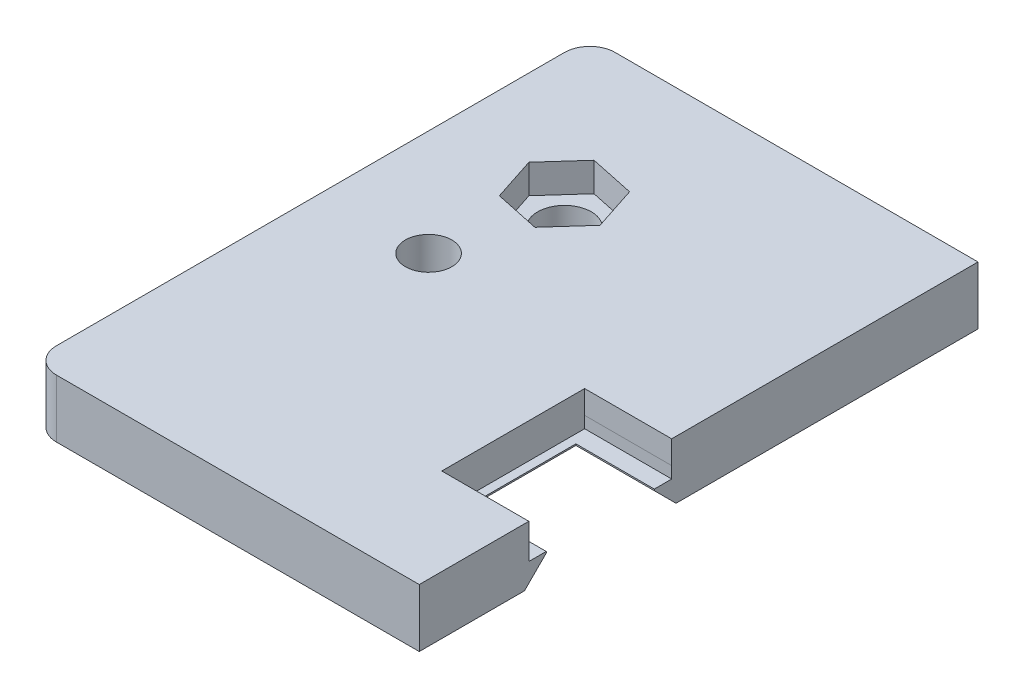
ISO-10303-21;
HEADER;
FILE_DESCRIPTION(('STEP AP214'),'2;1');
FILE_NAME('part.step','',(''),(''),'','','');
FILE_SCHEMA(('AUTOMOTIVE_DESIGN { 1 0 10303 214 1 1 1 1 }'));
ENDSEC;
DATA;
#1=APPLICATION_CONTEXT('core data for automotive mechanical design processes');
#2=APPLICATION_PROTOCOL_DEFINITION('international standard','automotive_design',2000,#1);
#3=PRODUCT_CONTEXT('',#1,'mechanical');
#4=PRODUCT('Part','Part','',(#3));
#5=PRODUCT_RELATED_PRODUCT_CATEGORY('part','',(#4));
#6=PRODUCT_DEFINITION_FORMATION('','',#4);
#7=PRODUCT_DEFINITION_CONTEXT('part definition',#1,'design');
#8=PRODUCT_DEFINITION('design','',#6,#7);
#9=PRODUCT_DEFINITION_SHAPE('','',#8);
#10=(LENGTH_UNIT() NAMED_UNIT(*) SI_UNIT(.MILLI.,.METRE.));
#11=(NAMED_UNIT(*) PLANE_ANGLE_UNIT() SI_UNIT($,.RADIAN.));
#12=(NAMED_UNIT(*) SI_UNIT($,.STERADIAN.) SOLID_ANGLE_UNIT());
#13=UNCERTAINTY_MEASURE_WITH_UNIT(LENGTH_MEASURE(1.E-05),#10,'distance_accuracy_value','');
#14=(GEOMETRIC_REPRESENTATION_CONTEXT(3) GLOBAL_UNCERTAINTY_ASSIGNED_CONTEXT((#13)) GLOBAL_UNIT_ASSIGNED_CONTEXT((#10,
#11,#12)) REPRESENTATION_CONTEXT('',''));
#15=CARTESIAN_POINT('',(0.,0.,0.));
#16=DIRECTION('',(0.,0.,1.));
#17=DIRECTION('',(1.,0.,0.));
#18=AXIS2_PLACEMENT_3D('',#15,#16,#17);
#19=CARTESIAN_POINT('',(0.,4.,0.));
#20=DIRECTION('',(0.,-1.,0.));
#21=DIRECTION('',(0.,0.,-1.));
#22=AXIS2_PLACEMENT_3D('',#19,#20,#21);
#23=PLANE('',#22);
#24=DIRECTION('',(0.,0.,1.));
#25=VECTOR('',#24,1.);
#26=CARTESIAN_POINT('',(0.,4.,0.));
#27=LINE('',#26,#25);
#28=CARTESIAN_POINT('',(0.,4.,-36.75));
#29=VERTEX_POINT('',#28);
#30=CARTESIAN_POINT('',(0.,4.,-1.75));
#31=VERTEX_POINT('',#30);
#32=EDGE_CURVE('E329',#29,#31,#27,.T.);
#33=ORIENTED_EDGE('',*,*,#32,.T.);
#34=CARTESIAN_POINT('',(1.75,4.,-1.75));
#35=DIRECTION('',(0.,-1.,0.));
#36=DIRECTION('',(0.,0.,-1.));
#37=AXIS2_PLACEMENT_3D('',#34,#35,#36);
#38=CIRCLE('',#37,1.75);
#39=CARTESIAN_POINT('',(1.75,4.,0.));
#40=VERTEX_POINT('',#39);
#41=EDGE_CURVE('E56',#31,#40,#38,.F.);
#42=ORIENTED_EDGE('',*,*,#41,.T.);
#43=DIRECTION('',(1.,0.,0.));
#44=VECTOR('',#43,1.);
#45=CARTESIAN_POINT('',(0.,4.,0.));
#46=LINE('',#45,#44);
#47=CARTESIAN_POINT('',(26.75,4.,0.));
#48=VERTEX_POINT('',#47);
#49=EDGE_CURVE('E332',#40,#48,#46,.T.);
#50=ORIENTED_EDGE('',*,*,#49,.T.);
#51=DIRECTION('',(0.,0.,-1.));
#52=VECTOR('',#51,1.);
#53=CARTESIAN_POINT('',(26.75,4.,0.));
#54=LINE('',#53,#52);
#55=CARTESIAN_POINT('',(26.75,4.,-7.55));
#56=VERTEX_POINT('',#55);
#57=EDGE_CURVE('E335',#48,#56,#54,.T.);
#58=ORIENTED_EDGE('',*,*,#57,.T.);
#59=DIRECTION('',(1.,0.,0.));
#60=VECTOR('',#59,1.);
#61=CARTESIAN_POINT('',(10.777724288724,4.,-7.55));
#62=LINE('',#61,#60);
#63=CARTESIAN_POINT('',(20.75,4.,-7.55));
#64=VERTEX_POINT('',#63);
#65=EDGE_CURVE('E278',#64,#56,#62,.T.);
#66=ORIENTED_EDGE('',*,*,#65,.F.);
#67=DIRECTION('',(0.,0.,-1.));
#68=VECTOR('',#67,1.);
#69=CARTESIAN_POINT('',(20.75,4.,-7.55));
#70=LINE('',#69,#68);
#71=CARTESIAN_POINT('',(20.75,4.,-17.3930829957745));
#72=VERTEX_POINT('',#71);
#73=EDGE_CURVE('E277',#64,#72,#70,.T.);
#74=ORIENTED_EDGE('',*,*,#73,.T.);
#75=DIRECTION('',(1.,0.,0.));
#76=VECTOR('',#75,1.);
#77=CARTESIAN_POINT('',(10.777724288724,4.,-17.3930829957745));
#78=LINE('',#77,#76);
#79=CARTESIAN_POINT('',(26.75,4.,-17.3930829957745));
#80=VERTEX_POINT('',#79);
#81=EDGE_CURVE('E286',#72,#80,#78,.T.);
#82=ORIENTED_EDGE('',*,*,#81,.T.);
#83=DIRECTION('',(0.,0.,-1.));
#84=VECTOR('',#83,1.);
#85=CARTESIAN_POINT('',(26.75,4.,-16.1946218655453));
#86=LINE('',#85,#84);
#87=CARTESIAN_POINT('',(26.75,4.,-38.5));
#88=VERTEX_POINT('',#87);
#89=EDGE_CURVE('E338',#80,#88,#86,.T.);
#90=ORIENTED_EDGE('',*,*,#89,.T.);
#91=DIRECTION('',(-1.,0.,0.));
#92=VECTOR('',#91,1.);
#93=CARTESIAN_POINT('',(0.,4.,-38.5));
#94=LINE('',#93,#92);
#95=CARTESIAN_POINT('',(1.75,4.,-38.5));
#96=VERTEX_POINT('',#95);
#97=EDGE_CURVE('E340',#88,#96,#94,.T.);
#98=ORIENTED_EDGE('',*,*,#97,.T.);
#99=CARTESIAN_POINT('',(1.75,4.,-36.75));
#100=DIRECTION('',(0.,-1.,0.));
#101=DIRECTION('',(0.,0.,-1.));
#102=AXIS2_PLACEMENT_3D('',#99,#100,#101);
#103=CIRCLE('',#102,1.75);
#104=EDGE_CURVE('E411',#96,#29,#103,.F.);
#105=ORIENTED_EDGE('',*,*,#104,.T.);
#106=EDGE_LOOP('',(#33,#42,#50,#58,#66,#74,#82,#90,#98,#105));
#107=FACE_BOUND('',#106,.T.);
#108=CARTESIAN_POINT('',(7.30700000000005,4.,-20.0850000000001));
#109=DIRECTION('',(0.,1.,0.));
#110=DIRECTION('',(0.,0.,1.));
#111=AXIS2_PLACEMENT_3D('',#108,#109,#110);
#112=CIRCLE('',#111,1.59999999999998);
#113=CARTESIAN_POINT('',(7.30700000000005,4.,-18.4850000000001));
#114=VERTEX_POINT('',#113);
#115=EDGE_CURVE('E268',#114,#114,#112,.T.);
#116=ORIENTED_EDGE('',*,*,#115,.F.);
#117=EDGE_LOOP('',(#116));
#118=FACE_BOUND('',#117,.T.);
#119=DIRECTION('',(-0.309846757313897,0.,-0.950786509676101));
#120=VECTOR('',#119,1.);
#121=CARTESIAN_POINT('',(11.5412550495234,4.,-27.6638868283969));
#122=LINE('',#121,#120);
#123=CARTESIAN_POINT('',(11.5412550495234,4.,-27.6638868283969));
#124=VERTEX_POINT('',#123);
#125=CARTESIAN_POINT('',(10.5573594514385,4.,-30.6830394885654));
#126=VERTEX_POINT('',#125);
#127=EDGE_CURVE('E211',#124,#126,#122,.T.);
#128=ORIENTED_EDGE('',*,*,#127,.F.);
#129=DIRECTION('',(0.668481892298094,0.,-0.743728417952117));
#130=VECTOR('',#129,1.);
#131=CARTESIAN_POINT('',(9.41853994695661,4.,-25.3022319156994));
#132=LINE('',#131,#130);
#133=CARTESIAN_POINT('',(9.41853994695661,4.,-25.3022319156994));
#134=VERTEX_POINT('',#133);
#135=EDGE_CURVE('E244',#134,#124,#132,.T.);
#136=ORIENTED_EDGE('',*,*,#135,.F.);
#137=DIRECTION('',(0.978328649611991,0.,0.207058091723984));
#138=VECTOR('',#137,1.);
#139=CARTESIAN_POINT('',(6.31192924630488,4.,-25.9597296631704));
#140=LINE('',#139,#138);
#141=CARTESIAN_POINT('',(6.31192924630488,4.,-25.9597296631704));
#142=VERTEX_POINT('',#141);
#143=EDGE_CURVE('E242',#142,#134,#140,.T.);
#144=ORIENTED_EDGE('',*,*,#143,.F.);
#145=DIRECTION('',(0.309846757313897,0.,0.950786509676101));
#146=VECTOR('',#145,1.);
#147=CARTESIAN_POINT('',(5.32803364821996,4.,-28.9788823233389));
#148=LINE('',#147,#146);
#149=CARTESIAN_POINT('',(5.32803364821996,4.,-28.9788823233389));
#150=VERTEX_POINT('',#149);
#151=EDGE_CURVE('E237',#150,#142,#148,.T.);
#152=ORIENTED_EDGE('',*,*,#151,.F.);
#153=DIRECTION('',(-0.668481892298094,0.,0.743728417952117));
#154=VECTOR('',#153,1.);
#155=CARTESIAN_POINT('',(7.45074875078679,4.,-31.3405372360364));
#156=LINE('',#155,#154);
#157=CARTESIAN_POINT('',(7.45074875078679,4.,-31.3405372360364));
#158=VERTEX_POINT('',#157);
#159=EDGE_CURVE('E235',#158,#150,#156,.T.);
#160=ORIENTED_EDGE('',*,*,#159,.F.);
#161=DIRECTION('',(-0.978328649611991,0.,-0.207058091723984));
#162=VECTOR('',#161,1.);
#163=CARTESIAN_POINT('',(10.5573594514385,4.,-30.6830394885654));
#164=LINE('',#163,#162);
#165=EDGE_CURVE('E222',#126,#158,#164,.T.);
#166=ORIENTED_EDGE('',*,*,#165,.F.);
#167=EDGE_LOOP('',(#128,#136,#144,#152,#160,#166));
#168=FACE_BOUND('',#167,.T.);
#169=ADVANCED_FACE('F48',(#107,#118,#168),#23,.F.);
#170=CARTESIAN_POINT('',(8.43464434887167,9.23259018078046,-28.3213845758679));
#171=DIRECTION('',(0.,-1.,0.));
#172=DIRECTION('',(0.,0.,-1.));
#173=AXIS2_PLACEMENT_3D('',#170,#171,#172);
#174=CYLINDRICAL_SURFACE('',#173,1.85);
#175=CARTESIAN_POINT('',(8.43464434887167,0.,-28.3213845758679));
#176=DIRECTION('',(0.,-1.,0.));
#177=DIRECTION('',(0.,0.,-1.));
#178=AXIS2_PLACEMENT_3D('',#175,#176,#177);
#179=CIRCLE('',#178,1.85);
#180=CARTESIAN_POINT('',(8.43464434887167,0.,-30.1713845758679));
#181=VERTEX_POINT('',#180);
#182=EDGE_CURVE('E230',#181,#181,#179,.T.);
#183=ORIENTED_EDGE('',*,*,#182,.T.);
#184=EDGE_LOOP('',(#183));
#185=FACE_BOUND('',#184,.T.);
#186=CARTESIAN_POINT('',(8.4346443488717,2.,-28.3213845758679));
#187=DIRECTION('',(0.,1.,0.));
#188=DIRECTION('',(0.743728417952117,0.,0.668481892298094));
#189=AXIS2_PLACEMENT_3D('',#186,#187,#188);
#190=CIRCLE('',#189,1.85);
#191=CARTESIAN_POINT('',(9.81054192208312,2.,-27.0846930751164));
#192=VERTEX_POINT('',#191);
#193=EDGE_CURVE('E248',#192,#192,#190,.T.);
#194=ORIENTED_EDGE('',*,*,#193,.T.);
#195=EDGE_LOOP('',(#194));
#196=FACE_BOUND('',#195,.T.);
#197=ADVANCED_FACE('F500',(#185,#196),#174,.F.);
#198=CARTESIAN_POINT('',(21.35,1.5,-16.1946218655453));
#199=DIRECTION('',(0.707106781186547,-0.707106781186548,0.));
#200=DIRECTION('',(0.,0.,1.));
#201=AXIS2_PLACEMENT_3D('',#198,#199,#200);
#202=PLANE('',#201);
#203=DIRECTION('',(-0.577350269189626,-0.577350269189625,-0.577350269189626));
#204=VECTOR('',#203,1.);
#205=CARTESIAN_POINT('',(21.35,1.5,-16.1946218655453));
#206=LINE('',#205,#204);
#207=CARTESIAN_POINT('',(21.35,1.5,-16.1946218655453));
#208=VERTEX_POINT('',#207);
#209=CARTESIAN_POINT('',(19.85,0.,-17.6946218655453));
#210=VERTEX_POINT('',#209);
#211=EDGE_CURVE('E397',#208,#210,#206,.T.);
#212=ORIENTED_EDGE('',*,*,#211,.F.);
#213=DIRECTION('',(0.,0.,-1.));
#214=VECTOR('',#213,1.);
#215=CARTESIAN_POINT('',(21.35,1.5,-7.25));
#216=LINE('',#215,#214);
#217=CARTESIAN_POINT('',(21.35,1.5,-8.75));
#218=VERTEX_POINT('',#217);
#219=EDGE_CURVE('E387',#218,#208,#216,.T.);
#220=ORIENTED_EDGE('',*,*,#219,.F.);
#221=DIRECTION('',(-0.577350269189626,-0.577350269189626,0.577350269189626));
#222=VECTOR('',#221,1.);
#223=CARTESIAN_POINT('',(23.15,3.3,-10.55));
#224=LINE('',#223,#222);
#225=CARTESIAN_POINT('',(19.85,0.,-7.25));
#226=VERTEX_POINT('',#225);
#227=EDGE_CURVE('E395',#218,#226,#224,.T.);
#228=ORIENTED_EDGE('',*,*,#227,.T.);
#229=DIRECTION('',(0.,0.,1.));
#230=VECTOR('',#229,1.);
#231=CARTESIAN_POINT('',(19.85,0.,-7.25));
#232=LINE('',#231,#230);
#233=EDGE_CURVE('E379',#210,#226,#232,.T.);
#234=ORIENTED_EDGE('',*,*,#233,.F.);
#235=EDGE_LOOP('',(#212,#220,#228,#234));
#236=FACE_BOUND('',#235,.T.);
#237=ADVANCED_FACE('F450',(#236),#202,.T.);
#238=CARTESIAN_POINT('',(26.75,1.5,-8.75));
#239=DIRECTION('',(0.,-0.707106781186547,-0.707106781186548));
#240=DIRECTION('',(1.,0.,0.));
#241=AXIS2_PLACEMENT_3D('',#238,#239,#240);
#242=PLANE('',#241);
#243=ORIENTED_EDGE('',*,*,#227,.F.);
#244=DIRECTION('',(-1.,0.,0.));
#245=VECTOR('',#244,1.);
#246=CARTESIAN_POINT('',(26.75,1.5,-8.75));
#247=LINE('',#246,#245);
#248=CARTESIAN_POINT('',(26.75,1.5,-8.75));
#249=VERTEX_POINT('',#248);
#250=EDGE_CURVE('E373',#249,#218,#247,.T.);
#251=ORIENTED_EDGE('',*,*,#250,.F.);
#252=DIRECTION('',(0.,0.707106781186548,-0.707106781186547));
#253=VECTOR('',#252,1.);
#254=CARTESIAN_POINT('',(26.75,1.5,-8.75));
#255=LINE('',#254,#253);
#256=CARTESIAN_POINT('',(26.75,0.,-7.25));
#257=VERTEX_POINT('',#256);
#258=EDGE_CURVE('E385',#257,#249,#255,.T.);
#259=ORIENTED_EDGE('',*,*,#258,.F.);
#260=DIRECTION('',(1.,0.,0.));
#261=VECTOR('',#260,1.);
#262=CARTESIAN_POINT('',(26.75,0.,-7.25));
#263=LINE('',#262,#261);
#264=EDGE_CURVE('E382',#226,#257,#263,.T.);
#265=ORIENTED_EDGE('',*,*,#264,.F.);
#266=EDGE_LOOP('',(#243,#251,#259,#265));
#267=FACE_BOUND('',#266,.T.);
#268=ADVANCED_FACE('F454',(#267),#242,.T.);
#269=CARTESIAN_POINT('',(26.75,1.5,-16.1946218655453));
#270=DIRECTION('',(0.,-0.707106781186548,0.707106781186547));
#271=DIRECTION('',(-1.,0.,0.));
#272=AXIS2_PLACEMENT_3D('',#269,#270,#271);
#273=PLANE('',#272);
#274=DIRECTION('',(1.,0.,0.));
#275=VECTOR('',#274,1.);
#276=CARTESIAN_POINT('',(19.85,1.5,-16.1946218655453));
#277=LINE('',#276,#275);
#278=CARTESIAN_POINT('',(26.75,1.5,-16.1946218655453));
#279=VERTEX_POINT('',#278);
#280=EDGE_CURVE('E390',#208,#279,#277,.T.);
#281=ORIENTED_EDGE('',*,*,#280,.F.);
#282=ORIENTED_EDGE('',*,*,#211,.T.);
#283=DIRECTION('',(-1.,0.,0.));
#284=VECTOR('',#283,1.);
#285=CARTESIAN_POINT('',(19.85,0.,-17.6946218655453));
#286=LINE('',#285,#284);
#287=CARTESIAN_POINT('',(26.75,0.,-17.6946218655453));
#288=VERTEX_POINT('',#287);
#289=EDGE_CURVE('E376',#288,#210,#286,.T.);
#290=ORIENTED_EDGE('',*,*,#289,.F.);
#291=DIRECTION('',(0.,-0.707106781186547,-0.707106781186548));
#292=VECTOR('',#291,1.);
#293=CARTESIAN_POINT('',(26.75,1.5,-16.1946218655453));
#294=LINE('',#293,#292);
#295=EDGE_CURVE('E393',#279,#288,#294,.T.);
#296=ORIENTED_EDGE('',*,*,#295,.F.);
#297=EDGE_LOOP('',(#281,#282,#290,#296));
#298=FACE_BOUND('',#297,.T.);
#299=ADVANCED_FACE('F447',(#298),#273,.T.);
#300=CARTESIAN_POINT('',(0.,4.,0.));
#301=DIRECTION('',(1.,0.,0.));
#302=DIRECTION('',(0.,0.,-1.));
#303=AXIS2_PLACEMENT_3D('',#300,#301,#302);
#304=PLANE('',#303);
#305=DIRECTION('',(0.,0.,1.));
#306=VECTOR('',#305,1.);
#307=CARTESIAN_POINT('',(0.,0.,0.));
#308=LINE('',#307,#306);
#309=CARTESIAN_POINT('',(0.,0.,-36.75));
#310=VERTEX_POINT('',#309);
#311=CARTESIAN_POINT('',(0.,0.,-1.75));
#312=VERTEX_POINT('',#311);
#313=EDGE_CURVE('E328',#310,#312,#308,.T.);
#314=ORIENTED_EDGE('',*,*,#313,.T.);
#315=DIRECTION('',(0.,-1.,0.));
#316=VECTOR('',#315,1.);
#317=CARTESIAN_POINT('',(0.,4.,-1.75));
#318=LINE('',#317,#316);
#319=EDGE_CURVE('E409',#312,#31,#318,.F.);
#320=ORIENTED_EDGE('',*,*,#319,.T.);
#321=ORIENTED_EDGE('',*,*,#32,.F.);
#322=DIRECTION('',(0.,-1.,0.));
#323=VECTOR('',#322,1.);
#324=CARTESIAN_POINT('',(0.,4.,-36.75));
#325=LINE('',#324,#323);
#326=EDGE_CURVE('E406',#29,#310,#325,.T.);
#327=ORIENTED_EDGE('',*,*,#326,.T.);
#328=EDGE_LOOP('',(#314,#320,#321,#327));
#329=FACE_BOUND('',#328,.T.);
#330=ADVANCED_FACE('F431',(#329),#304,.F.);
#331=CARTESIAN_POINT('',(0.,4.,0.));
#332=DIRECTION('',(0.,0.,-1.));
#333=DIRECTION('',(-1.,0.,0.));
#334=AXIS2_PLACEMENT_3D('',#331,#332,#333);
#335=PLANE('',#334);
#336=ORIENTED_EDGE('',*,*,#49,.F.);
#337=DIRECTION('',(0.,-1.,0.));
#338=VECTOR('',#337,1.);
#339=CARTESIAN_POINT('',(1.75,4.,0.));
#340=LINE('',#339,#338);
#341=CARTESIAN_POINT('',(1.75,0.,0.));
#342=VERTEX_POINT('',#341);
#343=EDGE_CURVE('E399',#40,#342,#340,.T.);
#344=ORIENTED_EDGE('',*,*,#343,.T.);
#345=DIRECTION('',(1.,0.,0.));
#346=VECTOR('',#345,1.);
#347=CARTESIAN_POINT('',(0.,0.,0.));
#348=LINE('',#347,#346);
#349=CARTESIAN_POINT('',(26.75,0.,0.));
#350=VERTEX_POINT('',#349);
#351=EDGE_CURVE('E345',#342,#350,#348,.T.);
#352=ORIENTED_EDGE('',*,*,#351,.T.);
#353=DIRECTION('',(0.,-1.,0.));
#354=VECTOR('',#353,1.);
#355=CARTESIAN_POINT('',(26.75,4.,0.));
#356=LINE('',#355,#354);
#357=EDGE_CURVE('E367',#48,#350,#356,.T.);
#358=ORIENTED_EDGE('',*,*,#357,.F.);
#359=EDGE_LOOP('',(#336,#344,#352,#358));
#360=FACE_BOUND('',#359,.T.);
#361=ADVANCED_FACE('F422',(#360),#335,.F.);
#362=CARTESIAN_POINT('',(26.75,4.,0.));
#363=DIRECTION('',(-1.,0.,0.));
#364=DIRECTION('',(0.,0.,1.));
#365=AXIS2_PLACEMENT_3D('',#362,#363,#364);
#366=PLANE('',#365);
#367=DIRECTION('',(0.,0.,-1.));
#368=VECTOR('',#367,1.);
#369=CARTESIAN_POINT('',(26.75,0.,0.));
#370=LINE('',#369,#368);
#371=EDGE_CURVE('E347',#350,#257,#370,.T.);
#372=ORIENTED_EDGE('',*,*,#371,.T.);
#373=ORIENTED_EDGE('',*,*,#258,.T.);
#374=DIRECTION('',(0.,-1.,0.));
#375=VECTOR('',#374,1.);
#376=CARTESIAN_POINT('',(26.75,4.,-8.75));
#377=LINE('',#376,#375);
#378=CARTESIAN_POINT('',(26.75,1.6,-8.75));
#379=VERTEX_POINT('',#378);
#380=EDGE_CURVE('E364',#379,#249,#377,.T.);
#381=ORIENTED_EDGE('',*,*,#380,.F.);
#382=DIRECTION('',(0.,0.,-1.));
#383=VECTOR('',#382,1.);
#384=CARTESIAN_POINT('',(26.75,1.6,-7.55));
#385=LINE('',#384,#383);
#386=CARTESIAN_POINT('',(26.75,1.6,-7.55));
#387=VERTEX_POINT('',#386);
#388=EDGE_CURVE('E306',#387,#379,#385,.T.);
#389=ORIENTED_EDGE('',*,*,#388,.F.);
#390=DIRECTION('',(0.,-1.,0.));
#391=VECTOR('',#390,1.);
#392=CARTESIAN_POINT('',(26.75,2.4,-7.55));
#393=LINE('',#392,#391);
#394=EDGE_CURVE('E281',#56,#387,#393,.T.);
#395=ORIENTED_EDGE('',*,*,#394,.F.);
#396=ORIENTED_EDGE('',*,*,#57,.F.);
#397=ORIENTED_EDGE('',*,*,#357,.T.);
#398=EDGE_LOOP('',(#372,#373,#381,#389,#395,#396,#397));
#399=FACE_BOUND('',#398,.T.);
#400=ADVANCED_FACE('F456',(#399),#366,.F.);
#401=CARTESIAN_POINT('',(26.75,4.,-8.75));
#402=DIRECTION('',(0.,0.,1.));
#403=DIRECTION('',(1.,0.,0.));
#404=AXIS2_PLACEMENT_3D('',#401,#402,#403);
#405=PLANE('',#404);
#406=ORIENTED_EDGE('',*,*,#380,.T.);
#407=ORIENTED_EDGE('',*,*,#250,.T.);
#408=DIRECTION('',(0.,-1.,0.));
#409=VECTOR('',#408,1.);
#410=CARTESIAN_POINT('',(21.35,4.,-8.75));
#411=LINE('',#410,#409);
#412=CARTESIAN_POINT('',(21.35,1.6,-8.75));
#413=VERTEX_POINT('',#412);
#414=EDGE_CURVE('E361',#413,#218,#411,.T.);
#415=ORIENTED_EDGE('',*,*,#414,.F.);
#416=DIRECTION('',(1.,0.,0.));
#417=VECTOR('',#416,1.);
#418=CARTESIAN_POINT('',(26.75,1.6,-8.75));
#419=LINE('',#418,#417);
#420=EDGE_CURVE('E325',#413,#379,#419,.T.);
#421=ORIENTED_EDGE('',*,*,#420,.T.);
#422=EDGE_LOOP('',(#406,#407,#415,#421));
#423=FACE_BOUND('',#422,.T.);
#424=ADVANCED_FACE('F487',(#423),#405,.F.);
#425=CARTESIAN_POINT('',(21.35,4.,-16.1946218655453));
#426=DIRECTION('',(-1.,0.,0.));
#427=DIRECTION('',(0.,0.,1.));
#428=AXIS2_PLACEMENT_3D('',#425,#426,#427);
#429=PLANE('',#428);
#430=ORIENTED_EDGE('',*,*,#414,.T.);
#431=ORIENTED_EDGE('',*,*,#219,.T.);
#432=DIRECTION('',(0.,-1.,0.));
#433=VECTOR('',#432,1.);
#434=CARTESIAN_POINT('',(21.35,4.,-16.1946218655453));
#435=LINE('',#434,#433);
#436=CARTESIAN_POINT('',(21.35,1.6,-16.1946218655453));
#437=VERTEX_POINT('',#436);
#438=EDGE_CURVE('E358',#437,#208,#435,.T.);
#439=ORIENTED_EDGE('',*,*,#438,.F.);
#440=DIRECTION('',(0.,0.,1.));
#441=VECTOR('',#440,1.);
#442=CARTESIAN_POINT('',(21.35,1.6,-16.1946218655453));
#443=LINE('',#442,#441);
#444=EDGE_CURVE('E322',#437,#413,#443,.T.);
#445=ORIENTED_EDGE('',*,*,#444,.T.);
#446=EDGE_LOOP('',(#430,#431,#439,#445));
#447=FACE_BOUND('',#446,.T.);
#448=ADVANCED_FACE('F484',(#447),#429,.F.);
#449=CARTESIAN_POINT('',(26.75,4.,-16.1946218655453));
#450=DIRECTION('',(0.,0.,-1.));
#451=DIRECTION('',(-1.,0.,0.));
#452=AXIS2_PLACEMENT_3D('',#449,#450,#451);
#453=PLANE('',#452);
#454=ORIENTED_EDGE('',*,*,#438,.T.);
#455=ORIENTED_EDGE('',*,*,#280,.T.);
#456=DIRECTION('',(0.,-1.,0.));
#457=VECTOR('',#456,1.);
#458=CARTESIAN_POINT('',(26.75,4.,-16.1946218655453));
#459=LINE('',#458,#457);
#460=CARTESIAN_POINT('',(26.75,1.6,-16.1946218655453));
#461=VERTEX_POINT('',#460);
#462=EDGE_CURVE('E355',#461,#279,#459,.T.);
#463=ORIENTED_EDGE('',*,*,#462,.F.);
#464=DIRECTION('',(-1.,0.,0.));
#465=VECTOR('',#464,1.);
#466=CARTESIAN_POINT('',(26.75,1.6,-16.1946218655453));
#467=LINE('',#466,#465);
#468=EDGE_CURVE('E315',#461,#437,#467,.T.);
#469=ORIENTED_EDGE('',*,*,#468,.T.);
#470=EDGE_LOOP('',(#454,#455,#463,#469));
#471=FACE_BOUND('',#470,.T.);
#472=ADVANCED_FACE('F481',(#471),#453,.F.);
#473=CARTESIAN_POINT('',(26.75,4.,-16.1946218655453));
#474=DIRECTION('',(-1.,0.,0.));
#475=DIRECTION('',(0.,0.,1.));
#476=AXIS2_PLACEMENT_3D('',#473,#474,#475);
#477=PLANE('',#476);
#478=ORIENTED_EDGE('',*,*,#462,.T.);
#479=ORIENTED_EDGE('',*,*,#295,.T.);
#480=DIRECTION('',(0.,0.,-1.));
#481=VECTOR('',#480,1.);
#482=CARTESIAN_POINT('',(26.75,0.,-16.1946218655453));
#483=LINE('',#482,#481);
#484=CARTESIAN_POINT('',(26.75,0.,-38.5));
#485=VERTEX_POINT('',#484);
#486=EDGE_CURVE('E350',#288,#485,#483,.T.);
#487=ORIENTED_EDGE('',*,*,#486,.T.);
#488=DIRECTION('',(0.,-1.,0.));
#489=VECTOR('',#488,1.);
#490=CARTESIAN_POINT('',(26.75,4.,-38.5));
#491=LINE('',#490,#489);
#492=EDGE_CURVE('E342',#88,#485,#491,.T.);
#493=ORIENTED_EDGE('',*,*,#492,.F.);
#494=ORIENTED_EDGE('',*,*,#89,.F.);
#495=DIRECTION('',(0.,1.,0.));
#496=VECTOR('',#495,1.);
#497=CARTESIAN_POINT('',(26.75,2.4,-17.3930829957745));
#498=LINE('',#497,#496);
#499=CARTESIAN_POINT('',(26.75,2.4,-17.3930829957745));
#500=VERTEX_POINT('',#499);
#501=EDGE_CURVE('E274',#500,#80,#498,.T.);
#502=ORIENTED_EDGE('',*,*,#501,.F.);
#503=DIRECTION('',(0.,0.,1.));
#504=VECTOR('',#503,1.);
#505=CARTESIAN_POINT('',(26.75,2.4,-7.55));
#506=LINE('',#505,#504);
#507=CARTESIAN_POINT('',(26.75,2.4,-17.3946218655453));
#508=VERTEX_POINT('',#507);
#509=EDGE_CURVE('E294',#508,#500,#506,.T.);
#510=ORIENTED_EDGE('',*,*,#509,.F.);
#511=DIRECTION('',(0.,1.,0.));
#512=VECTOR('',#511,1.);
#513=CARTESIAN_POINT('',(26.75,2.4,-17.3946218655453));
#514=LINE('',#513,#512);
#515=CARTESIAN_POINT('',(26.75,1.6,-17.3946218655453));
#516=VERTEX_POINT('',#515);
#517=EDGE_CURVE('E308',#516,#508,#514,.T.);
#518=ORIENTED_EDGE('',*,*,#517,.F.);
#519=DIRECTION('',(0.,0.,1.));
#520=VECTOR('',#519,1.);
#521=CARTESIAN_POINT('',(26.75,1.6,-16.1946218655453));
#522=LINE('',#521,#520);
#523=EDGE_CURVE('E370',#516,#461,#522,.T.);
#524=ORIENTED_EDGE('',*,*,#523,.T.);
#525=EDGE_LOOP('',(#478,#479,#487,#493,#494,#502,#510,#518,#524));
#526=FACE_BOUND('',#525,.T.);
#527=ADVANCED_FACE('F441',(#526),#477,.F.);
#528=CARTESIAN_POINT('',(0.,4.,-38.5));
#529=DIRECTION('',(0.,0.,1.));
#530=DIRECTION('',(1.,0.,0.));
#531=AXIS2_PLACEMENT_3D('',#528,#529,#530);
#532=PLANE('',#531);
#533=DIRECTION('',(-1.,0.,0.));
#534=VECTOR('',#533,1.);
#535=CARTESIAN_POINT('',(0.,0.,-38.5));
#536=LINE('',#535,#534);
#537=CARTESIAN_POINT('',(1.75,0.,-38.5));
#538=VERTEX_POINT('',#537);
#539=EDGE_CURVE('E333',#485,#538,#536,.T.);
#540=ORIENTED_EDGE('',*,*,#539,.T.);
#541=DIRECTION('',(0.,-1.,0.));
#542=VECTOR('',#541,1.);
#543=CARTESIAN_POINT('',(1.75,4.,-38.5));
#544=LINE('',#543,#542);
#545=EDGE_CURVE('E13',#538,#96,#544,.F.);
#546=ORIENTED_EDGE('',*,*,#545,.T.);
#547=ORIENTED_EDGE('',*,*,#97,.F.);
#548=ORIENTED_EDGE('',*,*,#492,.T.);
#549=EDGE_LOOP('',(#540,#546,#547,#548));
#550=FACE_BOUND('',#549,.T.);
#551=ADVANCED_FACE('F437',(#550),#532,.F.);
#552=CARTESIAN_POINT('',(0.,0.,0.));
#553=DIRECTION('',(0.,-1.,0.));
#554=DIRECTION('',(0.,0.,-1.));
#555=AXIS2_PLACEMENT_3D('',#552,#553,#554);
#556=PLANE('',#555);
#557=ORIENTED_EDGE('',*,*,#182,.F.);
#558=EDGE_LOOP('',(#557));
#559=FACE_BOUND('',#558,.T.);
#560=CARTESIAN_POINT('',(7.30700000000005,0.,-20.0850000000001));
#561=DIRECTION('',(0.,-1.,0.));
#562=DIRECTION('',(0.,0.,-1.));
#563=AXIS2_PLACEMENT_3D('',#560,#561,#562);
#564=CIRCLE('',#563,1.59999999999998);
#565=CARTESIAN_POINT('',(7.30700000000005,0.,-21.6850000000001));
#566=VERTEX_POINT('',#565);
#567=EDGE_CURVE('E271',#566,#566,#564,.F.);
#568=ORIENTED_EDGE('',*,*,#567,.T.);
#569=EDGE_LOOP('',(#568));
#570=FACE_BOUND('',#569,.T.);
#571=ORIENTED_EDGE('',*,*,#351,.F.);
#572=CARTESIAN_POINT('',(1.75,0.,-1.75));
#573=DIRECTION('',(0.,-1.,0.));
#574=DIRECTION('',(0.,0.,-1.));
#575=AXIS2_PLACEMENT_3D('',#572,#573,#574);
#576=CIRCLE('',#575,1.75);
#577=EDGE_CURVE('E404',#342,#312,#576,.T.);
#578=ORIENTED_EDGE('',*,*,#577,.T.);
#579=ORIENTED_EDGE('',*,*,#313,.F.);
#580=CARTESIAN_POINT('',(1.75,0.,-36.75));
#581=DIRECTION('',(0.,-1.,0.));
#582=DIRECTION('',(0.,0.,-1.));
#583=AXIS2_PLACEMENT_3D('',#580,#581,#582);
#584=CIRCLE('',#583,1.75);
#585=EDGE_CURVE('E402',#310,#538,#584,.T.);
#586=ORIENTED_EDGE('',*,*,#585,.T.);
#587=ORIENTED_EDGE('',*,*,#539,.F.);
#588=ORIENTED_EDGE('',*,*,#486,.F.);
#589=ORIENTED_EDGE('',*,*,#289,.T.);
#590=ORIENTED_EDGE('',*,*,#233,.T.);
#591=ORIENTED_EDGE('',*,*,#264,.T.);
#592=ORIENTED_EDGE('',*,*,#371,.F.);
#593=EDGE_LOOP('',(#571,#578,#579,#586,#587,#588,#589,#590,#591,#592));
#594=FACE_BOUND('',#593,.T.);
#595=ADVANCED_FACE('F428',(#559,#570,#594),#556,.T.);
#596=CARTESIAN_POINT('',(20.75,2.4,-7.55));
#597=DIRECTION('',(0.,1.,0.));
#598=DIRECTION('',(0.,0.,1.));
#599=AXIS2_PLACEMENT_3D('',#596,#597,#598);
#600=PLANE('',#599);
#601=ORIENTED_EDGE('',*,*,#509,.T.);
#602=DIRECTION('',(1.,0.,0.));
#603=VECTOR('',#602,1.);
#604=CARTESIAN_POINT('',(10.777724288724,2.4,-17.3930829957745));
#605=LINE('',#604,#603);
#606=CARTESIAN_POINT('',(20.75,2.4,-17.3930829957745));
#607=VERTEX_POINT('',#606);
#608=EDGE_CURVE('E283',#607,#500,#605,.T.);
#609=ORIENTED_EDGE('',*,*,#608,.F.);
#610=DIRECTION('',(0.,0.,1.));
#611=VECTOR('',#610,1.);
#612=CARTESIAN_POINT('',(20.75,2.4,-7.55));
#613=LINE('',#612,#611);
#614=CARTESIAN_POINT('',(20.75,2.4,-17.3946218655453));
#615=VERTEX_POINT('',#614);
#616=EDGE_CURVE('E300',#615,#607,#613,.T.);
#617=ORIENTED_EDGE('',*,*,#616,.F.);
#618=DIRECTION('',(1.,0.,0.));
#619=VECTOR('',#618,1.);
#620=CARTESIAN_POINT('',(20.75,2.4,-17.3946218655453));
#621=LINE('',#620,#619);
#622=EDGE_CURVE('E313',#615,#508,#621,.T.);
#623=ORIENTED_EDGE('',*,*,#622,.T.);
#624=EDGE_LOOP('',(#601,#609,#617,#623));
#625=FACE_BOUND('',#624,.T.);
#626=ADVANCED_FACE('F474',(#625),#600,.F.);
#627=CARTESIAN_POINT('',(20.75,1.6,-7.55));
#628=DIRECTION('',(0.,-1.,0.));
#629=DIRECTION('',(0.,0.,-1.));
#630=AXIS2_PLACEMENT_3D('',#627,#628,#629);
#631=PLANE('',#630);
#632=ORIENTED_EDGE('',*,*,#444,.F.);
#633=ORIENTED_EDGE('',*,*,#468,.F.);
#634=ORIENTED_EDGE('',*,*,#523,.F.);
#635=DIRECTION('',(1.,0.,0.));
#636=VECTOR('',#635,1.);
#637=CARTESIAN_POINT('',(20.75,1.6,-17.3946218655453));
#638=LINE('',#637,#636);
#639=CARTESIAN_POINT('',(20.75,1.6,-17.3946218655453));
#640=VERTEX_POINT('',#639);
#641=EDGE_CURVE('E316',#640,#516,#638,.T.);
#642=ORIENTED_EDGE('',*,*,#641,.F.);
#643=DIRECTION('',(0.,0.,-1.));
#644=VECTOR('',#643,1.);
#645=CARTESIAN_POINT('',(20.75,1.6,-7.55));
#646=LINE('',#645,#644);
#647=CARTESIAN_POINT('',(20.75,1.6,-7.55));
#648=VERTEX_POINT('',#647);
#649=EDGE_CURVE('E293',#648,#640,#646,.T.);
#650=ORIENTED_EDGE('',*,*,#649,.F.);
#651=DIRECTION('',(1.,0.,0.));
#652=VECTOR('',#651,1.);
#653=CARTESIAN_POINT('',(20.75,1.6,-7.55));
#654=LINE('',#653,#652);
#655=EDGE_CURVE('E303',#648,#387,#654,.T.);
#656=ORIENTED_EDGE('',*,*,#655,.T.);
#657=ORIENTED_EDGE('',*,*,#388,.T.);
#658=ORIENTED_EDGE('',*,*,#420,.F.);
#659=EDGE_LOOP('',(#632,#633,#634,#642,#650,#656,#657,#658));
#660=FACE_BOUND('',#659,.T.);
#661=ADVANCED_FACE('F488',(#660),#631,.F.);
#662=CARTESIAN_POINT('',(20.75,2.4,-7.55));
#663=DIRECTION('',(0.,0.,1.));
#664=DIRECTION('',(1.,0.,0.));
#665=AXIS2_PLACEMENT_3D('',#662,#663,#664);
#666=PLANE('',#665);
#667=ORIENTED_EDGE('',*,*,#394,.T.);
#668=ORIENTED_EDGE('',*,*,#655,.F.);
#669=DIRECTION('',(0.,-1.,0.));
#670=VECTOR('',#669,1.);
#671=CARTESIAN_POINT('',(20.75,2.4,-7.55));
#672=LINE('',#671,#670);
#673=EDGE_CURVE('E290',#64,#648,#672,.T.);
#674=ORIENTED_EDGE('',*,*,#673,.F.);
#675=ORIENTED_EDGE('',*,*,#65,.T.);
#676=EDGE_LOOP('',(#667,#668,#674,#675));
#677=FACE_BOUND('',#676,.T.);
#678=ADVANCED_FACE('F462',(#677),#666,.F.);
#679=CARTESIAN_POINT('',(20.75,2.4,-17.3946218655453));
#680=DIRECTION('',(0.,0.,-1.));
#681=DIRECTION('',(-1.,0.,0.));
#682=AXIS2_PLACEMENT_3D('',#679,#680,#681);
#683=PLANE('',#682);
#684=ORIENTED_EDGE('',*,*,#517,.T.);
#685=ORIENTED_EDGE('',*,*,#622,.F.);
#686=DIRECTION('',(0.,1.,0.));
#687=VECTOR('',#686,1.);
#688=CARTESIAN_POINT('',(20.75,2.4,-17.3946218655453));
#689=LINE('',#688,#687);
#690=EDGE_CURVE('E297',#640,#615,#689,.T.);
#691=ORIENTED_EDGE('',*,*,#690,.F.);
#692=ORIENTED_EDGE('',*,*,#641,.T.);
#693=EDGE_LOOP('',(#684,#685,#691,#692));
#694=FACE_BOUND('',#693,.T.);
#695=ADVANCED_FACE('F477',(#694),#683,.F.);
#696=CARTESIAN_POINT('',(20.75,0.,0.));
#697=DIRECTION('',(1.,0.,0.));
#698=DIRECTION('',(0.,0.,-1.));
#699=AXIS2_PLACEMENT_3D('',#696,#697,#698);
#700=PLANE('',#699);
#701=ORIENTED_EDGE('',*,*,#673,.T.);
#702=ORIENTED_EDGE('',*,*,#649,.T.);
#703=ORIENTED_EDGE('',*,*,#690,.T.);
#704=ORIENTED_EDGE('',*,*,#616,.T.);
#705=DIRECTION('',(0.,-1.,0.));
#706=VECTOR('',#705,1.);
#707=CARTESIAN_POINT('',(20.75,2.4,-17.3930829957745));
#708=LINE('',#707,#706);
#709=EDGE_CURVE('E275',#72,#607,#708,.T.);
#710=ORIENTED_EDGE('',*,*,#709,.F.);
#711=ORIENTED_EDGE('',*,*,#73,.F.);
#712=EDGE_LOOP('',(#701,#702,#703,#704,#710,#711));
#713=FACE_BOUND('',#712,.T.);
#714=ADVANCED_FACE('F465',(#713),#700,.T.);
#715=CARTESIAN_POINT('',(10.777724288724,2.4,-17.3930829957745));
#716=DIRECTION('',(0.,0.,-1.));
#717=DIRECTION('',(-1.,0.,0.));
#718=AXIS2_PLACEMENT_3D('',#715,#716,#717);
#719=PLANE('',#718);
#720=ORIENTED_EDGE('',*,*,#709,.T.);
#721=ORIENTED_EDGE('',*,*,#608,.T.);
#722=ORIENTED_EDGE('',*,*,#501,.T.);
#723=ORIENTED_EDGE('',*,*,#81,.F.);
#724=EDGE_LOOP('',(#720,#721,#722,#723));
#725=FACE_BOUND('',#724,.T.);
#726=ADVANCED_FACE('F470',(#725),#719,.F.);
#727=CARTESIAN_POINT('',(7.30700000000005,-4.52548339959384,-20.0850000000001));
#728=DIRECTION('',(0.,1.,0.));
#729=DIRECTION('',(0.,0.,1.));
#730=AXIS2_PLACEMENT_3D('',#727,#728,#729);
#731=CYLINDRICAL_SURFACE('',#730,1.59999999999998);
#732=ORIENTED_EDGE('',*,*,#115,.T.);
#733=EDGE_LOOP('',(#732));
#734=FACE_BOUND('',#733,.T.);
#735=ORIENTED_EDGE('',*,*,#567,.F.);
#736=EDGE_LOOP('',(#735));
#737=FACE_BOUND('',#736,.T.);
#738=ADVANCED_FACE('F542',(#734,#737),#731,.F.);
#739=CARTESIAN_POINT('',(1.75,4.,-1.75));
#740=DIRECTION('',(0.,-1.,0.));
#741=DIRECTION('',(0.,0.,-1.));
#742=AXIS2_PLACEMENT_3D('',#739,#740,#741);
#743=CYLINDRICAL_SURFACE('',#742,1.75);
#744=ORIENTED_EDGE('',*,*,#41,.F.);
#745=ORIENTED_EDGE('',*,*,#319,.F.);
#746=ORIENTED_EDGE('',*,*,#577,.F.);
#747=ORIENTED_EDGE('',*,*,#343,.F.);
#748=EDGE_LOOP('',(#744,#745,#746,#747));
#749=FACE_BOUND('',#748,.T.);
#750=ADVANCED_FACE('F425',(#749),#743,.T.);
#751=CARTESIAN_POINT('',(1.75,4.,-36.75));
#752=DIRECTION('',(0.,-1.,0.));
#753=DIRECTION('',(0.,0.,-1.));
#754=AXIS2_PLACEMENT_3D('',#751,#752,#753);
#755=CYLINDRICAL_SURFACE('',#754,1.75);
#756=ORIENTED_EDGE('',*,*,#104,.F.);
#757=ORIENTED_EDGE('',*,*,#545,.F.);
#758=ORIENTED_EDGE('',*,*,#585,.F.);
#759=ORIENTED_EDGE('',*,*,#326,.F.);
#760=EDGE_LOOP('',(#756,#757,#758,#759));
#761=FACE_BOUND('',#760,.T.);
#762=ADVANCED_FACE('F50',(#761),#755,.T.);
#763=CARTESIAN_POINT('',(8.4346443488717,2.,-28.3213845758679));
#764=DIRECTION('',(0.,1.,0.));
#765=DIRECTION('',(0.743728417952117,0.,0.668481892298094));
#766=AXIS2_PLACEMENT_3D('',#763,#764,#765);
#767=PLANE('',#766);
#768=DIRECTION('',(-0.309846757313897,0.,-0.950786509676101));
#769=VECTOR('',#768,1.);
#770=CARTESIAN_POINT('',(11.5412550495234,2.,-27.6638868283969));
#771=LINE('',#770,#769);
#772=CARTESIAN_POINT('',(11.5412550495234,2.,-27.6638868283969));
#773=VERTEX_POINT('',#772);
#774=CARTESIAN_POINT('',(10.5573594514385,2.,-30.6830394885654));
#775=VERTEX_POINT('',#774);
#776=EDGE_CURVE('E246',#773,#775,#771,.T.);
#777=ORIENTED_EDGE('',*,*,#776,.T.);
#778=DIRECTION('',(-0.978328649611991,0.,-0.207058091723984));
#779=VECTOR('',#778,1.);
#780=CARTESIAN_POINT('',(10.5573594514385,2.,-30.6830394885654));
#781=LINE('',#780,#779);
#782=CARTESIAN_POINT('',(7.45074875078679,2.,-31.3405372360364));
#783=VERTEX_POINT('',#782);
#784=EDGE_CURVE('E229',#775,#783,#781,.T.);
#785=ORIENTED_EDGE('',*,*,#784,.T.);
#786=DIRECTION('',(-0.668481892298094,0.,0.743728417952117));
#787=VECTOR('',#786,1.);
#788=CARTESIAN_POINT('',(7.45074875078679,2.,-31.3405372360364));
#789=LINE('',#788,#787);
#790=CARTESIAN_POINT('',(5.32803364821996,2.,-28.9788823233389));
#791=VERTEX_POINT('',#790);
#792=EDGE_CURVE('E250',#783,#791,#789,.T.);
#793=ORIENTED_EDGE('',*,*,#792,.T.);
#794=DIRECTION('',(0.309846757313897,0.,0.950786509676101));
#795=VECTOR('',#794,1.);
#796=CARTESIAN_POINT('',(5.32803364821996,2.,-28.9788823233389));
#797=LINE('',#796,#795);
#798=CARTESIAN_POINT('',(6.31192924630488,2.,-25.9597296631704));
#799=VERTEX_POINT('',#798);
#800=EDGE_CURVE('E252',#791,#799,#797,.T.);
#801=ORIENTED_EDGE('',*,*,#800,.T.);
#802=DIRECTION('',(0.978328649611991,0.,0.207058091723984));
#803=VECTOR('',#802,1.);
#804=CARTESIAN_POINT('',(6.31192924630488,2.,-25.9597296631704));
#805=LINE('',#804,#803);
#806=CARTESIAN_POINT('',(9.41853994695661,2.,-25.3022319156994));
#807=VERTEX_POINT('',#806);
#808=EDGE_CURVE('E254',#799,#807,#805,.T.);
#809=ORIENTED_EDGE('',*,*,#808,.T.);
#810=DIRECTION('',(0.668481892298094,0.,-0.743728417952117));
#811=VECTOR('',#810,1.);
#812=CARTESIAN_POINT('',(9.41853994695661,2.,-25.3022319156994));
#813=LINE('',#812,#811);
#814=EDGE_CURVE('E223',#807,#773,#813,.T.);
#815=ORIENTED_EDGE('',*,*,#814,.T.);
#816=EDGE_LOOP('',(#777,#785,#793,#801,#809,#815));
#817=FACE_BOUND('',#816,.T.);
#818=ORIENTED_EDGE('',*,*,#193,.F.);
#819=EDGE_LOOP('',(#818));
#820=FACE_BOUND('',#819,.T.);
#821=ADVANCED_FACE('F546',(#817,#820),#767,.T.);
#822=CARTESIAN_POINT('',(11.5412550495234,4.,-27.6638868283969));
#823=DIRECTION('',(-0.950786509676101,0.,0.309846757313897));
#824=DIRECTION('',(0.309846757313897,0.,0.950786509676101));
#825=AXIS2_PLACEMENT_3D('',#822,#823,#824);
#826=PLANE('',#825);
#827=ORIENTED_EDGE('',*,*,#776,.F.);
#828=DIRECTION('',(0.,-1.,0.));
#829=VECTOR('',#828,1.);
#830=CARTESIAN_POINT('',(11.5412550495234,4.,-27.6638868283969));
#831=LINE('',#830,#829);
#832=EDGE_CURVE('E218',#124,#773,#831,.T.);
#833=ORIENTED_EDGE('',*,*,#832,.F.);
#834=ORIENTED_EDGE('',*,*,#127,.T.);
#835=DIRECTION('',(0.,-1.,0.));
#836=VECTOR('',#835,1.);
#837=CARTESIAN_POINT('',(10.5573594514385,4.,-30.6830394885654));
#838=LINE('',#837,#836);
#839=EDGE_CURVE('E215',#126,#775,#838,.T.);
#840=ORIENTED_EDGE('',*,*,#839,.T.);
#841=EDGE_LOOP('',(#827,#833,#834,#840));
#842=FACE_BOUND('',#841,.T.);
#843=ADVANCED_FACE('F214',(#842),#826,.T.);
#844=CARTESIAN_POINT('',(10.5573594514385,4.,-30.6830394885654));
#845=DIRECTION('',(-0.207058091723984,0.,0.978328649611991));
#846=DIRECTION('',(0.978328649611991,0.,0.207058091723984));
#847=AXIS2_PLACEMENT_3D('',#844,#845,#846);
#848=PLANE('',#847);
#849=ORIENTED_EDGE('',*,*,#784,.F.);
#850=ORIENTED_EDGE('',*,*,#839,.F.);
#851=ORIENTED_EDGE('',*,*,#165,.T.);
#852=DIRECTION('',(0.,-1.,0.));
#853=VECTOR('',#852,1.);
#854=CARTESIAN_POINT('',(7.45074875078679,4.,-31.3405372360364));
#855=LINE('',#854,#853);
#856=EDGE_CURVE('E231',#158,#783,#855,.T.);
#857=ORIENTED_EDGE('',*,*,#856,.T.);
#858=EDGE_LOOP('',(#849,#850,#851,#857));
#859=FACE_BOUND('',#858,.T.);
#860=ADVANCED_FACE('F226',(#859),#848,.T.);
#861=CARTESIAN_POINT('',(7.45074875078679,4.,-31.3405372360364));
#862=DIRECTION('',(0.743728417952117,0.,0.668481892298094));
#863=DIRECTION('',(0.668481892298094,0.,-0.743728417952117));
#864=AXIS2_PLACEMENT_3D('',#861,#862,#863);
#865=PLANE('',#864);
#866=ORIENTED_EDGE('',*,*,#792,.F.);
#867=ORIENTED_EDGE('',*,*,#856,.F.);
#868=ORIENTED_EDGE('',*,*,#159,.T.);
#869=DIRECTION('',(0.,-1.,0.));
#870=VECTOR('',#869,1.);
#871=CARTESIAN_POINT('',(5.32803364821996,4.,-28.9788823233389));
#872=LINE('',#871,#870);
#873=EDGE_CURVE('E262',#150,#791,#872,.T.);
#874=ORIENTED_EDGE('',*,*,#873,.T.);
#875=EDGE_LOOP('',(#866,#867,#868,#874));
#876=FACE_BOUND('',#875,.T.);
#877=ADVANCED_FACE('F649',(#876),#865,.T.);
#878=CARTESIAN_POINT('',(5.32803364821996,4.,-28.9788823233389));
#879=DIRECTION('',(0.950786509676101,0.,-0.309846757313897));
#880=DIRECTION('',(-0.309846757313897,0.,-0.950786509676101));
#881=AXIS2_PLACEMENT_3D('',#878,#879,#880);
#882=PLANE('',#881);
#883=ORIENTED_EDGE('',*,*,#800,.F.);
#884=ORIENTED_EDGE('',*,*,#873,.F.);
#885=ORIENTED_EDGE('',*,*,#151,.T.);
#886=DIRECTION('',(0.,-1.,0.));
#887=VECTOR('',#886,1.);
#888=CARTESIAN_POINT('',(6.31192924630488,4.,-25.9597296631704));
#889=LINE('',#888,#887);
#890=EDGE_CURVE('E259',#142,#799,#889,.T.);
#891=ORIENTED_EDGE('',*,*,#890,.T.);
#892=EDGE_LOOP('',(#883,#884,#885,#891));
#893=FACE_BOUND('',#892,.T.);
#894=ADVANCED_FACE('F658',(#893),#882,.T.);
#895=CARTESIAN_POINT('',(6.31192924630488,4.,-25.9597296631704));
#896=DIRECTION('',(0.207058091723984,0.,-0.978328649611991));
#897=DIRECTION('',(-0.978328649611991,0.,-0.207058091723984));
#898=AXIS2_PLACEMENT_3D('',#895,#896,#897);
#899=PLANE('',#898);
#900=ORIENTED_EDGE('',*,*,#808,.F.);
#901=ORIENTED_EDGE('',*,*,#890,.F.);
#902=ORIENTED_EDGE('',*,*,#143,.T.);
#903=DIRECTION('',(0.,-1.,0.));
#904=VECTOR('',#903,1.);
#905=CARTESIAN_POINT('',(9.41853994695661,4.,-25.3022319156994));
#906=LINE('',#905,#904);
#907=EDGE_CURVE('E63',#134,#807,#906,.T.);
#908=ORIENTED_EDGE('',*,*,#907,.T.);
#909=EDGE_LOOP('',(#900,#901,#902,#908));
#910=FACE_BOUND('',#909,.T.);
#911=ADVANCED_FACE('F668',(#910),#899,.T.);
#912=CARTESIAN_POINT('',(9.41853994695661,4.,-25.3022319156994));
#913=DIRECTION('',(-0.743728417952117,0.,-0.668481892298094));
#914=DIRECTION('',(-0.668481892298095,0.,0.743728417952117));
#915=AXIS2_PLACEMENT_3D('',#912,#913,#914);
#916=PLANE('',#915);
#917=ORIENTED_EDGE('',*,*,#814,.F.);
#918=ORIENTED_EDGE('',*,*,#907,.F.);
#919=ORIENTED_EDGE('',*,*,#135,.T.);
#920=ORIENTED_EDGE('',*,*,#832,.T.);
#921=EDGE_LOOP('',(#917,#918,#919,#920));
#922=FACE_BOUND('',#921,.T.);
#923=ADVANCED_FACE('F678',(#922),#916,.T.);
#924=CLOSED_SHELL('',(#169,#197,#237,#268,#299,#330,#361,#400,#424,#448,#472,#527,#551,#595,
#626,#661,#678,#695,#714,#726,#738,#750,#762,#821,#843,#860,#877,#894,#911,#923));
#925=MANIFOLD_SOLID_BREP('B2',#924);
#926=ADVANCED_BREP_SHAPE_REPRESENTATION('',(#18,#925),#14);
#927=SHAPE_DEFINITION_REPRESENTATION(#9,#926);
ENDSEC;
END-ISO-10303-21;
